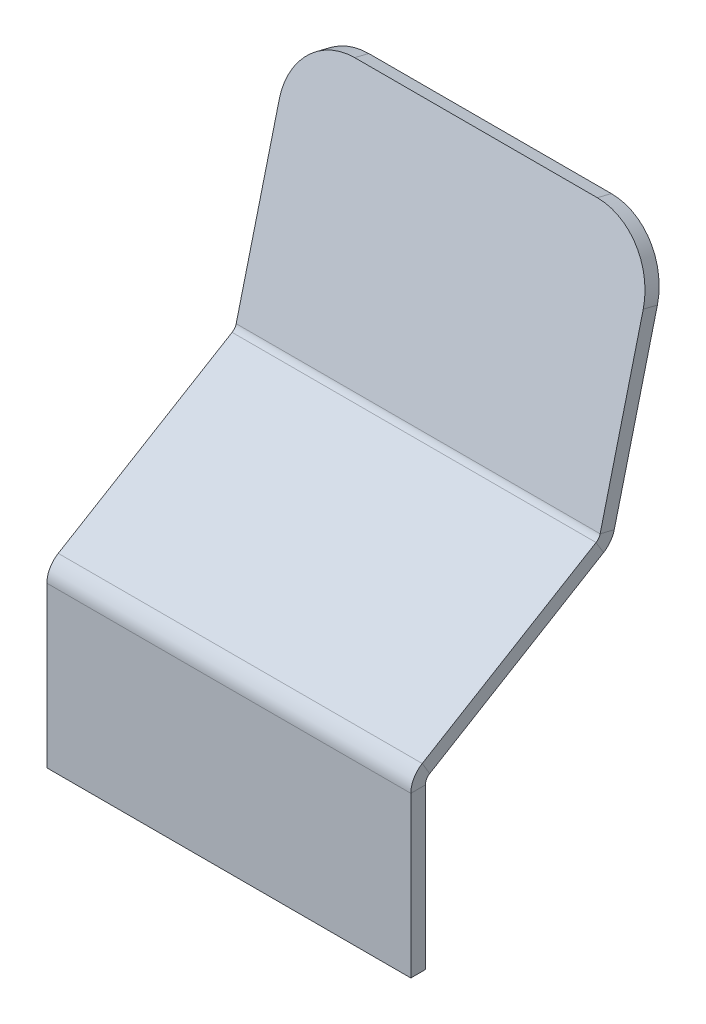
ISO-10303-21;
HEADER;
FILE_DESCRIPTION(('STEP AP214'),'2;1');
FILE_NAME('part.step','',(''),(''),'','','');
FILE_SCHEMA(('AUTOMOTIVE_DESIGN { 1 0 10303 214 1 1 1 1 }'));
ENDSEC;
DATA;
#1=APPLICATION_CONTEXT('core data for automotive mechanical design processes');
#2=APPLICATION_PROTOCOL_DEFINITION('international standard','automotive_design',2000,#1);
#3=PRODUCT_CONTEXT('',#1,'mechanical');
#4=PRODUCT('Part','Part','',(#3));
#5=PRODUCT_RELATED_PRODUCT_CATEGORY('part','',(#4));
#6=PRODUCT_DEFINITION_FORMATION('','',#4);
#7=PRODUCT_DEFINITION_CONTEXT('part definition',#1,'design');
#8=PRODUCT_DEFINITION('design','',#6,#7);
#9=PRODUCT_DEFINITION_SHAPE('','',#8);
#10=(LENGTH_UNIT() NAMED_UNIT(*) SI_UNIT(.MILLI.,.METRE.));
#11=(NAMED_UNIT(*) PLANE_ANGLE_UNIT() SI_UNIT($,.RADIAN.));
#12=(NAMED_UNIT(*) SI_UNIT($,.STERADIAN.) SOLID_ANGLE_UNIT());
#13=UNCERTAINTY_MEASURE_WITH_UNIT(LENGTH_MEASURE(1.E-05),#10,'distance_accuracy_value','');
#14=(GEOMETRIC_REPRESENTATION_CONTEXT(3) GLOBAL_UNCERTAINTY_ASSIGNED_CONTEXT((#13)) GLOBAL_UNIT_ASSIGNED_CONTEXT((#10,
#11,#12)) REPRESENTATION_CONTEXT('',''));
#15=CARTESIAN_POINT('',(0.,0.,0.));
#16=DIRECTION('',(0.,0.,1.));
#17=DIRECTION('',(1.,0.,0.));
#18=AXIS2_PLACEMENT_3D('',#15,#16,#17);
#19=CARTESIAN_POINT('',(15.,16.984718308508,-15.7852220767239));
#20=DIRECTION('',(-1.,0.,0.));
#21=DIRECTION('',(0.,-1.,0.));
#22=AXIS2_PLACEMENT_3D('',#19,#20,#21);
#23=PLANE('',#22);
#24=DIRECTION('',(0.,-0.85716730070211,-0.515038074910058));
#25=VECTOR('',#24,1.);
#26=CARTESIAN_POINT('',(15.,15.9535265939989,-14.0690308638967));
#27=LINE('',#26,#25);
#28=CARTESIAN_POINT('',(15.,15.9535265939989,-14.0690308638967));
#29=VERTEX_POINT('',#28);
#30=CARTESIAN_POINT('',(15.,14.9249258331564,-14.6870765537888));
#31=VERTEX_POINT('',#30);
#32=EDGE_CURVE('E220',#29,#31,#27,.T.);
#33=ORIENTED_EDGE('',*,*,#32,.F.);
#34=DIRECTION('',(0.,0.515038074910059,-0.85716730070211));
#35=VECTOR('',#34,1.);
#36=CARTESIAN_POINT('',(15.,7.12864068418413,0.618045689892071));
#37=LINE('',#36,#35);
#38=CARTESIAN_POINT('',(15.,7.3432818894682,0.260822735870822));
#39=VERTEX_POINT('',#38);
#40=EDGE_CURVE('E228',#39,#29,#37,.T.);
#41=ORIENTED_EDGE('',*,*,#40,.F.);
#42=DIRECTION('',(0.,-0.85716730070211,-0.515038074910059));
#43=VECTOR('',#42,1.);
#44=CARTESIAN_POINT('',(15.,6.31468112862567,-0.357222954021248));
#45=LINE('',#44,#43);
#46=CARTESIAN_POINT('',(15.,6.31468112862566,-0.357222954021249));
#47=VERTEX_POINT('',#46);
#48=EDGE_CURVE('E239',#47,#39,#45,.F.);
#49=ORIENTED_EDGE('',*,*,#48,.F.);
#50=DIRECTION('',(0.,-0.515038074910059,0.85716730070211));
#51=VECTOR('',#50,1.);
#52=CARTESIAN_POINT('',(15.,15.9561175476654,-16.403267766616));
#53=LINE('',#52,#51);
#54=EDGE_CURVE('E233',#47,#31,#53,.F.);
#55=ORIENTED_EDGE('',*,*,#54,.T.);
#56=EDGE_LOOP('',(#33,#41,#49,#55));
#57=FACE_BOUND('',#56,.T.);
#58=ADVANCED_FACE('F68',(#57),#23,.F.);
#59=CARTESIAN_POINT('',(-15.,7.12864068418413,0.618045689892071));
#60=DIRECTION('',(1.,0.,0.));
#61=DIRECTION('',(0.,1.,0.));
#62=AXIS2_PLACEMENT_3D('',#59,#60,#61);
#63=PLANE('',#62);
#64=DIRECTION('',(0.,-0.85716730070211,-0.515038074910058));
#65=VECTOR('',#64,1.);
#66=CARTESIAN_POINT('',(-15.,15.9535265939989,-14.0690308638967));
#67=LINE('',#66,#65);
#68=CARTESIAN_POINT('',(-15.,15.9535265939989,-14.0690308638967));
#69=VERTEX_POINT('',#68);
#70=CARTESIAN_POINT('',(-15.,14.9249258331564,-14.6870765537888));
#71=VERTEX_POINT('',#70);
#72=EDGE_CURVE('E218',#69,#71,#67,.T.);
#73=ORIENTED_EDGE('',*,*,#72,.T.);
#74=DIRECTION('',(0.,0.515038074910059,-0.85716730070211));
#75=VECTOR('',#74,1.);
#76=CARTESIAN_POINT('',(-15.,6.1000399233416,0.));
#77=LINE('',#76,#75);
#78=CARTESIAN_POINT('',(-15.,6.31468112862566,-0.357222954021251));
#79=VERTEX_POINT('',#78);
#80=EDGE_CURVE('E231',#71,#79,#77,.F.);
#81=ORIENTED_EDGE('',*,*,#80,.T.);
#82=DIRECTION('',(0.,-0.85716730070211,-0.515038074910059));
#83=VECTOR('',#82,1.);
#84=CARTESIAN_POINT('',(-15.,7.34328188946819,0.26082273587082));
#85=LINE('',#84,#83);
#86=CARTESIAN_POINT('',(-15.,7.3432818894682,0.26082273587082));
#87=VERTEX_POINT('',#86);
#88=EDGE_CURVE('E223',#79,#87,#85,.F.);
#89=ORIENTED_EDGE('',*,*,#88,.T.);
#90=DIRECTION('',(0.,-0.515038074910059,0.85716730070211));
#91=VECTOR('',#90,1.);
#92=CARTESIAN_POINT('',(-15.,7.12864068418413,0.618045689892071));
#93=LINE('',#92,#91);
#94=EDGE_CURVE('E225',#69,#87,#93,.T.);
#95=ORIENTED_EDGE('',*,*,#94,.F.);
#96=EDGE_LOOP('',(#73,#81,#89,#95));
#97=FACE_BOUND('',#96,.T.);
#98=ADVANCED_FACE('F343',(#97),#63,.F.);
#99=CARTESIAN_POINT('',(15.,7.12864068418413,0.618045689892071));
#100=DIRECTION('',(0.,-0.85716730070211,-0.515038074910059));
#101=DIRECTION('',(0.,0.515038074910059,-0.85716730070211));
#102=AXIS2_PLACEMENT_3D('',#99,#100,#101);
#103=PLANE('',#102);
#104=DIRECTION('',(-1.,0.,0.));
#105=VECTOR('',#104,1.);
#106=CARTESIAN_POINT('',(-15.,15.9535265939989,-14.0690308638967));
#107=LINE('',#106,#105);
#108=EDGE_CURVE('E213',#69,#29,#107,.F.);
#109=ORIENTED_EDGE('',*,*,#108,.F.);
#110=ORIENTED_EDGE('',*,*,#94,.T.);
#111=DIRECTION('',(1.,0.,0.));
#112=VECTOR('',#111,1.);
#113=CARTESIAN_POINT('',(-15.,7.3432818894682,0.26082273587082));
#114=LINE('',#113,#112);
#115=EDGE_CURVE('E236',#39,#87,#114,.F.);
#116=ORIENTED_EDGE('',*,*,#115,.F.);
#117=ORIENTED_EDGE('',*,*,#40,.T.);
#118=EDGE_LOOP('',(#109,#110,#116,#117));
#119=FACE_BOUND('',#118,.T.);
#120=ADVANCED_FACE('F333',(#119),#103,.F.);
#121=CARTESIAN_POINT('',(15.,6.1000399233416,0.));
#122=DIRECTION('',(0.,-0.85716730070211,-0.515038074910059));
#123=DIRECTION('',(0.,0.515038074910059,-0.85716730070211));
#124=AXIS2_PLACEMENT_3D('',#121,#122,#123);
#125=PLANE('',#124);
#126=ORIENTED_EDGE('',*,*,#80,.F.);
#127=DIRECTION('',(-1.,0.,0.));
#128=VECTOR('',#127,1.);
#129=CARTESIAN_POINT('',(-15.,14.9249258331564,-14.6870765537888));
#130=LINE('',#129,#128);
#131=EDGE_CURVE('E187',#71,#31,#130,.F.);
#132=ORIENTED_EDGE('',*,*,#131,.T.);
#133=ORIENTED_EDGE('',*,*,#54,.F.);
#134=DIRECTION('',(1.,0.,0.));
#135=VECTOR('',#134,1.);
#136=CARTESIAN_POINT('',(-15.,6.31468112862566,-0.35722295402125));
#137=LINE('',#136,#135);
#138=EDGE_CURVE('E242',#79,#47,#137,.T.);
#139=ORIENTED_EDGE('',*,*,#138,.F.);
#140=EDGE_LOOP('',(#126,#132,#133,#139));
#141=FACE_BOUND('',#140,.T.);
#142=ADVANCED_FACE('F347',(#141),#125,.T.);
#143=CARTESIAN_POINT('',(-15.,7.5,1.2));
#144=DIRECTION('',(1.,0.,0.));
#145=DIRECTION('',(0.,1.,0.));
#146=AXIS2_PLACEMENT_3D('',#143,#144,#145);
#147=PLANE('',#146);
#148=DIRECTION('',(0.,0.,1.));
#149=VECTOR('',#148,1.);
#150=CARTESIAN_POINT('',(-15.,5.68329169492849,0.));
#151=LINE('',#150,#149);
#152=CARTESIAN_POINT('',(-15.,5.68329169492849,0.));
#153=VERTEX_POINT('',#152);
#154=CARTESIAN_POINT('',(-15.,5.68329169492849,1.2));
#155=VERTEX_POINT('',#154);
#156=EDGE_CURVE('E263',#153,#155,#151,.T.);
#157=ORIENTED_EDGE('',*,*,#156,.F.);
#158=DIRECTION('',(0.,-1.,0.));
#159=VECTOR('',#158,1.);
#160=CARTESIAN_POINT('',(-15.,7.5,0.));
#161=LINE('',#160,#159);
#162=CARTESIAN_POINT('',(-15.,-7.5,0.));
#163=VERTEX_POINT('',#162);
#164=EDGE_CURVE('E266',#153,#163,#161,.T.);
#165=ORIENTED_EDGE('',*,*,#164,.T.);
#166=DIRECTION('',(0.,0.,-1.));
#167=VECTOR('',#166,1.);
#168=CARTESIAN_POINT('',(-15.,-7.5,1.2));
#169=LINE('',#168,#167);
#170=CARTESIAN_POINT('',(-15.,-7.5,1.2));
#171=VERTEX_POINT('',#170);
#172=EDGE_CURVE('E285',#171,#163,#169,.T.);
#173=ORIENTED_EDGE('',*,*,#172,.F.);
#174=DIRECTION('',(0.,-1.,0.));
#175=VECTOR('',#174,1.);
#176=CARTESIAN_POINT('',(-15.,7.5,1.2));
#177=LINE('',#176,#175);
#178=EDGE_CURVE('E275',#155,#171,#177,.T.);
#179=ORIENTED_EDGE('',*,*,#178,.F.);
#180=EDGE_LOOP('',(#157,#165,#173,#179));
#181=FACE_BOUND('',#180,.T.);
#182=ADVANCED_FACE('F70',(#181),#147,.F.);
#183=CARTESIAN_POINT('',(15.,7.5,1.2));
#184=DIRECTION('',(-1.,0.,0.));
#185=DIRECTION('',(0.,-1.,0.));
#186=AXIS2_PLACEMENT_3D('',#183,#184,#185);
#187=PLANE('',#186);
#188=DIRECTION('',(0.,0.,1.));
#189=VECTOR('',#188,1.);
#190=CARTESIAN_POINT('',(15.,5.68329169492849,0.));
#191=LINE('',#190,#189);
#192=CARTESIAN_POINT('',(15.,5.68329169492849,0.));
#193=VERTEX_POINT('',#192);
#194=CARTESIAN_POINT('',(15.,5.6832916949285,1.2));
#195=VERTEX_POINT('',#194);
#196=EDGE_CURVE('E260',#193,#195,#191,.T.);
#197=ORIENTED_EDGE('',*,*,#196,.T.);
#198=DIRECTION('',(0.,1.,0.));
#199=VECTOR('',#198,1.);
#200=CARTESIAN_POINT('',(15.,7.5,1.2));
#201=LINE('',#200,#199);
#202=CARTESIAN_POINT('',(15.,-7.5,1.2));
#203=VERTEX_POINT('',#202);
#204=EDGE_CURVE('E279',#203,#195,#201,.T.);
#205=ORIENTED_EDGE('',*,*,#204,.F.);
#206=DIRECTION('',(0.,0.,-1.));
#207=VECTOR('',#206,1.);
#208=CARTESIAN_POINT('',(15.,-7.5,1.2));
#209=LINE('',#208,#207);
#210=CARTESIAN_POINT('',(15.,-7.5,0.));
#211=VERTEX_POINT('',#210);
#212=EDGE_CURVE('E282',#203,#211,#209,.T.);
#213=ORIENTED_EDGE('',*,*,#212,.T.);
#214=DIRECTION('',(0.,1.,0.));
#215=VECTOR('',#214,1.);
#216=CARTESIAN_POINT('',(15.,7.5,0.));
#217=LINE('',#216,#215);
#218=EDGE_CURVE('E272',#211,#193,#217,.T.);
#219=ORIENTED_EDGE('',*,*,#218,.T.);
#220=EDGE_LOOP('',(#197,#205,#213,#219));
#221=FACE_BOUND('',#220,.T.);
#222=ADVANCED_FACE('F356',(#221),#187,.F.);
#223=CARTESIAN_POINT('',(-15.,-7.5,1.2));
#224=DIRECTION('',(0.,0.,1.));
#225=DIRECTION('',(1.,0.,0.));
#226=AXIS2_PLACEMENT_3D('',#223,#224,#225);
#227=PLANE('',#226);
#228=ORIENTED_EDGE('',*,*,#204,.T.);
#229=DIRECTION('',(1.,0.,0.));
#230=VECTOR('',#229,1.);
#231=CARTESIAN_POINT('',(15.,5.6832916949285,1.2));
#232=LINE('',#231,#230);
#233=EDGE_CURVE('E254',#195,#155,#232,.F.);
#234=ORIENTED_EDGE('',*,*,#233,.T.);
#235=ORIENTED_EDGE('',*,*,#178,.T.);
#236=DIRECTION('',(1.,0.,0.));
#237=VECTOR('',#236,1.);
#238=CARTESIAN_POINT('',(-15.,-7.5,1.2));
#239=LINE('',#238,#237);
#240=EDGE_CURVE('E277',#171,#203,#239,.T.);
#241=ORIENTED_EDGE('',*,*,#240,.T.);
#242=EDGE_LOOP('',(#228,#234,#235,#241));
#243=FACE_BOUND('',#242,.T.);
#244=ADVANCED_FACE('F359',(#243),#227,.T.);
#245=CARTESIAN_POINT('',(-15.,-7.5,0.));
#246=DIRECTION('',(0.,0.,1.));
#247=DIRECTION('',(1.,0.,0.));
#248=AXIS2_PLACEMENT_3D('',#245,#246,#247);
#249=PLANE('',#248);
#250=DIRECTION('',(1.,0.,0.));
#251=VECTOR('',#250,1.);
#252=CARTESIAN_POINT('',(15.,5.68329169492849,0.));
#253=LINE('',#252,#251);
#254=EDGE_CURVE('E250',#193,#153,#253,.F.);
#255=ORIENTED_EDGE('',*,*,#254,.F.);
#256=ORIENTED_EDGE('',*,*,#218,.F.);
#257=DIRECTION('',(1.,0.,0.));
#258=VECTOR('',#257,1.);
#259=CARTESIAN_POINT('',(-15.,-7.5,0.));
#260=LINE('',#259,#258);
#261=EDGE_CURVE('E270',#163,#211,#260,.T.);
#262=ORIENTED_EDGE('',*,*,#261,.F.);
#263=ORIENTED_EDGE('',*,*,#164,.F.);
#264=EDGE_LOOP('',(#255,#256,#262,#263));
#265=FACE_BOUND('',#264,.T.);
#266=ADVANCED_FACE('F368',(#265),#249,.F.);
#267=CARTESIAN_POINT('',(-15.,-7.5,1.2));
#268=DIRECTION('',(0.,1.,0.));
#269=DIRECTION('',(-1.,0.,0.));
#270=AXIS2_PLACEMENT_3D('',#267,#268,#269);
#271=PLANE('',#270);
#272=ORIENTED_EDGE('',*,*,#261,.T.);
#273=ORIENTED_EDGE('',*,*,#212,.F.);
#274=ORIENTED_EDGE('',*,*,#240,.F.);
#275=ORIENTED_EDGE('',*,*,#172,.T.);
#276=EDGE_LOOP('',(#272,#273,#274,#275));
#277=FACE_BOUND('',#276,.T.);
#278=ADVANCED_FACE('F365',(#277),#271,.F.);
#279=CARTESIAN_POINT('',(-15.,5.68329169492849,-0.736599999999999));
#280=DIRECTION('',(-1.,0.,0.));
#281=DIRECTION('',(0.,0.,1.));
#282=AXIS2_PLACEMENT_3D('',#279,#280,#281);
#283=PLANE('',#282);
#284=ORIENTED_EDGE('',*,*,#88,.F.);
#285=CARTESIAN_POINT('',(-15.,5.68329169492849,-0.736599999999999));
#286=DIRECTION('',(1.,0.,0.));
#287=DIRECTION('',(0.,0.,-1.));
#288=AXIS2_PLACEMENT_3D('',#285,#286,#287);
#289=CIRCLE('',#288,0.736599999999999);
#290=EDGE_CURVE('E246',#153,#79,#289,.F.);
#291=ORIENTED_EDGE('',*,*,#290,.F.);
#292=ORIENTED_EDGE('',*,*,#156,.T.);
#293=CARTESIAN_POINT('',(-15.,5.68329169492849,-0.736599999999999));
#294=DIRECTION('',(1.,0.,0.));
#295=DIRECTION('',(0.,0.,-1.));
#296=AXIS2_PLACEMENT_3D('',#293,#294,#295);
#297=CIRCLE('',#296,1.9366);
#298=EDGE_CURVE('E257',#155,#87,#297,.F.);
#299=ORIENTED_EDGE('',*,*,#298,.T.);
#300=EDGE_LOOP('',(#284,#291,#292,#299));
#301=FACE_BOUND('',#300,.T.);
#302=ADVANCED_FACE('F339',(#301),#283,.T.);
#303=CARTESIAN_POINT('',(15.,5.68329169492849,-0.736599999999997));
#304=DIRECTION('',(-1.,0.,0.));
#305=DIRECTION('',(0.,0.,1.));
#306=AXIS2_PLACEMENT_3D('',#303,#304,#305);
#307=PLANE('',#306);
#308=CARTESIAN_POINT('',(15.,5.68329169492849,-0.736599999999997));
#309=DIRECTION('',(1.,0.,0.));
#310=DIRECTION('',(0.,0.,-1.));
#311=AXIS2_PLACEMENT_3D('',#308,#309,#310);
#312=CIRCLE('',#311,0.736599999999999);
#313=EDGE_CURVE('E227',#47,#193,#312,.T.);
#314=ORIENTED_EDGE('',*,*,#313,.F.);
#315=ORIENTED_EDGE('',*,*,#48,.T.);
#316=CARTESIAN_POINT('',(15.,5.68329169492849,-0.736599999999997));
#317=DIRECTION('',(1.,0.,0.));
#318=DIRECTION('',(0.,0.,-1.));
#319=AXIS2_PLACEMENT_3D('',#316,#317,#318);
#320=CIRCLE('',#319,1.9366);
#321=EDGE_CURVE('E249',#39,#195,#320,.T.);
#322=ORIENTED_EDGE('',*,*,#321,.T.);
#323=ORIENTED_EDGE('',*,*,#196,.F.);
#324=EDGE_LOOP('',(#314,#315,#322,#323));
#325=FACE_BOUND('',#324,.T.);
#326=ADVANCED_FACE('F353',(#325),#307,.F.);
#327=CARTESIAN_POINT('',(15.,5.68329169492849,-0.736599999999997));
#328=DIRECTION('',(1.,0.,0.));
#329=DIRECTION('',(0.,0.85716730070211,0.515038074910059));
#330=AXIS2_PLACEMENT_3D('',#327,#328,#329);
#331=CYLINDRICAL_SURFACE('',#330,1.9366);
#332=ORIENTED_EDGE('',*,*,#233,.F.);
#333=ORIENTED_EDGE('',*,*,#321,.F.);
#334=ORIENTED_EDGE('',*,*,#115,.T.);
#335=ORIENTED_EDGE('',*,*,#298,.F.);
#336=EDGE_LOOP('',(#332,#333,#334,#335));
#337=FACE_BOUND('',#336,.T.);
#338=ADVANCED_FACE('F336',(#337),#331,.T.);
#339=CARTESIAN_POINT('',(15.,5.68329169492849,-0.736599999999997));
#340=DIRECTION('',(1.,0.,0.));
#341=DIRECTION('',(0.,0.85716730070211,0.515038074910059));
#342=AXIS2_PLACEMENT_3D('',#339,#340,#341);
#343=CYLINDRICAL_SURFACE('',#342,0.736599999999999);
#344=ORIENTED_EDGE('',*,*,#254,.T.);
#345=ORIENTED_EDGE('',*,*,#290,.T.);
#346=ORIENTED_EDGE('',*,*,#138,.T.);
#347=ORIENTED_EDGE('',*,*,#313,.T.);
#348=EDGE_LOOP('',(#344,#345,#346,#347));
#349=FACE_BOUND('',#348,.T.);
#350=ADVANCED_FACE('F350',(#349),#343,.F.);
#351=CARTESIAN_POINT('',(15.,16.5849160276961,-13.6896538179179));
#352=DIRECTION('',(1.,0.,0.));
#353=DIRECTION('',(0.,0.,-1.));
#354=AXIS2_PLACEMENT_3D('',#351,#352,#353);
#355=PLANE('',#354);
#356=DIRECTION('',(0.,-0.241921895599667,-0.970295726275997));
#357=VECTOR('',#356,1.);
#358=CARTESIAN_POINT('',(15.,16.1164100846778,-15.568728521424));
#359=LINE('',#358,#357);
#360=CARTESIAN_POINT('',(15.,16.4067163593974,-14.4043736498928));
#361=VERTEX_POINT('',#360);
#362=CARTESIAN_POINT('',(15.,16.1164100846778,-15.568728521424));
#363=VERTEX_POINT('',#362);
#364=EDGE_CURVE('E208',#361,#363,#359,.T.);
#365=ORIENTED_EDGE('',*,*,#364,.F.);
#366=CARTESIAN_POINT('',(15.,16.5849160276961,-13.6896538179179));
#367=DIRECTION('',(-1.,0.,0.));
#368=DIRECTION('',(0.,0.,1.));
#369=AXIS2_PLACEMENT_3D('',#366,#367,#368);
#370=CIRCLE('',#369,0.736599999999993);
#371=EDGE_CURVE('E190',#29,#361,#370,.F.);
#372=ORIENTED_EDGE('',*,*,#371,.F.);
#373=ORIENTED_EDGE('',*,*,#32,.T.);
#374=CARTESIAN_POINT('',(15.,16.5849160276961,-13.6896538179179));
#375=DIRECTION('',(-1.,0.,0.));
#376=DIRECTION('',(0.,0.,1.));
#377=AXIS2_PLACEMENT_3D('',#374,#375,#376);
#378=CIRCLE('',#377,1.93659999999999);
#379=EDGE_CURVE('E217',#31,#363,#378,.F.);
#380=ORIENTED_EDGE('',*,*,#379,.T.);
#381=EDGE_LOOP('',(#365,#372,#373,#380));
#382=FACE_BOUND('',#381,.T.);
#383=ADVANCED_FACE('F326',(#382),#355,.T.);
#384=CARTESIAN_POINT('',(-15.,16.5849160276961,-13.6896538179179));
#385=DIRECTION('',(1.,0.,0.));
#386=DIRECTION('',(0.,0.,-1.));
#387=AXIS2_PLACEMENT_3D('',#384,#385,#386);
#388=PLANE('',#387);
#389=CARTESIAN_POINT('',(-15.,16.5849160276961,-13.6896538179179));
#390=DIRECTION('',(-1.,0.,0.));
#391=DIRECTION('',(0.,0.,1.));
#392=AXIS2_PLACEMENT_3D('',#389,#390,#391);
#393=CIRCLE('',#392,0.736599999999993);
#394=CARTESIAN_POINT('',(-15.,16.4067163593974,-14.4043736498928));
#395=VERTEX_POINT('',#394);
#396=EDGE_CURVE('E177',#395,#69,#393,.T.);
#397=ORIENTED_EDGE('',*,*,#396,.F.);
#398=DIRECTION('',(0.,-0.241921895599667,-0.970295726275997));
#399=VECTOR('',#398,1.);
#400=CARTESIAN_POINT('',(-15.,16.4067163593974,-14.4043736498928));
#401=LINE('',#400,#399);
#402=CARTESIAN_POINT('',(-15.,16.1164100846778,-15.568728521424));
#403=VERTEX_POINT('',#402);
#404=EDGE_CURVE('E174',#395,#403,#401,.T.);
#405=ORIENTED_EDGE('',*,*,#404,.T.);
#406=CARTESIAN_POINT('',(-15.,16.5849160276961,-13.6896538179179));
#407=DIRECTION('',(-1.,0.,0.));
#408=DIRECTION('',(0.,0.,1.));
#409=AXIS2_PLACEMENT_3D('',#406,#407,#408);
#410=CIRCLE('',#409,1.93659999999999);
#411=EDGE_CURVE('E182',#403,#71,#410,.T.);
#412=ORIENTED_EDGE('',*,*,#411,.T.);
#413=ORIENTED_EDGE('',*,*,#72,.F.);
#414=EDGE_LOOP('',(#397,#405,#412,#413));
#415=FACE_BOUND('',#414,.T.);
#416=ADVANCED_FACE('F193',(#415),#388,.F.);
#417=CARTESIAN_POINT('',(-15.,16.5849160276961,-13.6896538179179));
#418=DIRECTION('',(-1.,0.,0.));
#419=DIRECTION('',(0.,-0.241921895599667,-0.970295726275997));
#420=AXIS2_PLACEMENT_3D('',#417,#418,#419);
#421=CYLINDRICAL_SURFACE('',#420,1.93659999999999);
#422=ORIENTED_EDGE('',*,*,#131,.F.);
#423=ORIENTED_EDGE('',*,*,#411,.F.);
#424=DIRECTION('',(-1.,0.,0.));
#425=VECTOR('',#424,1.);
#426=CARTESIAN_POINT('',(-15.,16.1164100846778,-15.568728521424));
#427=LINE('',#426,#425);
#428=EDGE_CURVE('E184',#363,#403,#427,.T.);
#429=ORIENTED_EDGE('',*,*,#428,.F.);
#430=ORIENTED_EDGE('',*,*,#379,.F.);
#431=EDGE_LOOP('',(#422,#423,#429,#430));
#432=FACE_BOUND('',#431,.T.);
#433=ADVANCED_FACE('F183',(#432),#421,.T.);
#434=CARTESIAN_POINT('',(-15.,16.5849160276961,-13.6896538179179));
#435=DIRECTION('',(-1.,0.,0.));
#436=DIRECTION('',(0.,-0.241921895599667,-0.970295726275997));
#437=AXIS2_PLACEMENT_3D('',#434,#435,#436);
#438=CYLINDRICAL_SURFACE('',#437,0.736599999999993);
#439=ORIENTED_EDGE('',*,*,#108,.T.);
#440=ORIENTED_EDGE('',*,*,#371,.T.);
#441=DIRECTION('',(1.,0.,0.));
#442=VECTOR('',#441,1.);
#443=CARTESIAN_POINT('',(15.,16.4067163593974,-14.4043736498928));
#444=LINE('',#443,#442);
#445=EDGE_CURVE('E195',#361,#395,#444,.F.);
#446=ORIENTED_EDGE('',*,*,#445,.T.);
#447=ORIENTED_EDGE('',*,*,#396,.T.);
#448=EDGE_LOOP('',(#439,#440,#446,#447));
#449=FACE_BOUND('',#448,.T.);
#450=ADVANCED_FACE('F321',(#449),#438,.F.);
#451=CARTESIAN_POINT('',(-15.,15.8203634369768,-15.4949158020043));
#452=DIRECTION('',(-1.,0.,0.));
#453=DIRECTION('',(0.,0.,1.));
#454=AXIS2_PLACEMENT_3D('',#451,#452,#453);
#455=PLANE('',#454);
#456=DIRECTION('',(0.,0.970295726275997,-0.241921895599667));
#457=VECTOR('',#456,1.);
#458=CARTESIAN_POINT('',(-15.,16.1106697116964,-14.3305609304731));
#459=LINE('',#458,#457);
#460=CARTESIAN_POINT('',(-15.,30.6651056058363,-17.9593893644681));
#461=VERTEX_POINT('',#460);
#462=EDGE_CURVE('E311',#461,#395,#459,.F.);
#463=ORIENTED_EDGE('',*,*,#462,.F.);
#464=DIRECTION('',(0.,0.241921895599667,0.970295726275997));
#465=VECTOR('',#464,1.);
#466=CARTESIAN_POINT('',(-15.,30.3747993311167,-19.1237442359993));
#467=LINE('',#466,#465);
#468=CARTESIAN_POINT('',(-15.,30.3747993311167,-19.1237442359993));
#469=VERTEX_POINT('',#468);
#470=EDGE_CURVE('E91',#461,#469,#467,.F.);
#471=ORIENTED_EDGE('',*,*,#470,.T.);
#472=DIRECTION('',(0.,-0.970295726275997,0.241921895599667));
#473=VECTOR('',#472,1.);
#474=CARTESIAN_POINT('',(-15.,15.8203634369768,-15.4949158020043));
#475=LINE('',#474,#473);
#476=EDGE_CURVE('E170',#469,#403,#475,.T.);
#477=ORIENTED_EDGE('',*,*,#476,.T.);
#478=ORIENTED_EDGE('',*,*,#404,.F.);
#479=EDGE_LOOP('',(#463,#471,#477,#478));
#480=FACE_BOUND('',#479,.T.);
#481=ADVANCED_FACE('F172',(#480),#455,.T.);
#482=CARTESIAN_POINT('',(15.,35.2262779624967,-20.3333537139977));
#483=DIRECTION('',(1.,0.,0.));
#484=DIRECTION('',(0.,1.,0.));
#485=AXIS2_PLACEMENT_3D('',#482,#483,#484);
#486=PLANE('',#485);
#487=DIRECTION('',(0.,0.970295726275997,-0.241921895599667));
#488=VECTOR('',#487,1.);
#489=CARTESIAN_POINT('',(15.,35.2262779624967,-20.3333537139977));
#490=LINE('',#489,#488);
#491=CARTESIAN_POINT('',(15.,30.3747993311167,-19.1237442359993));
#492=VERTEX_POINT('',#491);
#493=EDGE_CURVE('E198',#363,#492,#490,.T.);
#494=ORIENTED_EDGE('',*,*,#493,.T.);
#495=DIRECTION('',(0.,0.241921895599667,0.970295726275997));
#496=VECTOR('',#495,1.);
#497=CARTESIAN_POINT('',(15.,30.3747993311167,-19.1237442359993));
#498=LINE('',#497,#496);
#499=CARTESIAN_POINT('',(15.,30.6651056058363,-17.9593893644681));
#500=VERTEX_POINT('',#499);
#501=EDGE_CURVE('E13',#492,#500,#498,.T.);
#502=ORIENTED_EDGE('',*,*,#501,.T.);
#503=DIRECTION('',(0.,-0.970295726275997,0.241921895599667));
#504=VECTOR('',#503,1.);
#505=CARTESIAN_POINT('',(15.,16.1106697116964,-14.3305609304731));
#506=LINE('',#505,#504);
#507=EDGE_CURVE('E199',#361,#500,#506,.F.);
#508=ORIENTED_EDGE('',*,*,#507,.F.);
#509=ORIENTED_EDGE('',*,*,#364,.T.);
#510=EDGE_LOOP('',(#494,#502,#508,#509));
#511=FACE_BOUND('',#510,.T.);
#512=ADVANCED_FACE('F316',(#511),#486,.T.);
#513=CARTESIAN_POINT('',(-15.,15.8203634369768,-15.4949158020043));
#514=DIRECTION('',(0.,-0.241921895599667,-0.970295726275997));
#515=DIRECTION('',(0.,0.970295726275997,-0.241921895599667));
#516=AXIS2_PLACEMENT_3D('',#513,#514,#515);
#517=PLANE('',#516);
#518=ORIENTED_EDGE('',*,*,#476,.F.);
#519=CARTESIAN_POINT('',(-9.99999999999999,30.3747993311167,-19.1237442359993));
#520=DIRECTION('',(0.,-0.241921895599667,-0.970295726275997));
#521=DIRECTION('',(0.,0.970295726275997,-0.241921895599667));
#522=AXIS2_PLACEMENT_3D('',#519,#520,#521);
#523=CIRCLE('',#522,5.);
#524=CARTESIAN_POINT('',(-9.99999999999999,35.2262779624967,-20.3333537139977));
#525=VERTEX_POINT('',#524);
#526=EDGE_CURVE('E76',#469,#525,#523,.T.);
#527=ORIENTED_EDGE('',*,*,#526,.T.);
#528=DIRECTION('',(-1.,0.,0.));
#529=VECTOR('',#528,1.);
#530=CARTESIAN_POINT('',(-15.,35.2262779624967,-20.3333537139977));
#531=LINE('',#530,#529);
#532=CARTESIAN_POINT('',(10.,35.2262779624967,-20.3333537139977));
#533=VERTEX_POINT('',#532);
#534=EDGE_CURVE('E178',#533,#525,#531,.T.);
#535=ORIENTED_EDGE('',*,*,#534,.F.);
#536=CARTESIAN_POINT('',(10.,30.3747993311167,-19.1237442359993));
#537=DIRECTION('',(0.,-0.241921895599667,-0.970295726275997));
#538=DIRECTION('',(0.,0.970295726275997,-0.241921895599667));
#539=AXIS2_PLACEMENT_3D('',#536,#537,#538);
#540=CIRCLE('',#539,5.);
#541=EDGE_CURVE('E83',#533,#492,#540,.T.);
#542=ORIENTED_EDGE('',*,*,#541,.T.);
#543=ORIENTED_EDGE('',*,*,#493,.F.);
#544=ORIENTED_EDGE('',*,*,#428,.T.);
#545=EDGE_LOOP('',(#518,#527,#535,#542,#543,#544));
#546=FACE_BOUND('',#545,.T.);
#547=ADVANCED_FACE('F197',(#546),#517,.T.);
#548=CARTESIAN_POINT('',(-15.,16.1106697116964,-14.3305609304731));
#549=DIRECTION('',(0.,-0.241921895599667,-0.970295726275997));
#550=DIRECTION('',(0.,0.970295726275997,-0.241921895599667));
#551=AXIS2_PLACEMENT_3D('',#548,#549,#550);
#552=PLANE('',#551);
#553=DIRECTION('',(1.,0.,0.));
#554=VECTOR('',#553,1.);
#555=CARTESIAN_POINT('',(-15.,35.5165842372163,-19.1689988424665));
#556=LINE('',#555,#554);
#557=CARTESIAN_POINT('',(10.,35.5165842372163,-19.1689988424665));
#558=VERTEX_POINT('',#557);
#559=CARTESIAN_POINT('',(-9.99999999999999,35.5165842372163,-19.1689988424665));
#560=VERTEX_POINT('',#559);
#561=EDGE_CURVE('E202',#558,#560,#556,.F.);
#562=ORIENTED_EDGE('',*,*,#561,.T.);
#563=CARTESIAN_POINT('',(-9.99999999999999,30.6651056058363,-17.9593893644681));
#564=DIRECTION('',(0.,-0.241921895599667,-0.970295726275997));
#565=DIRECTION('',(0.,0.970295726275997,-0.241921895599667));
#566=AXIS2_PLACEMENT_3D('',#563,#564,#565);
#567=CIRCLE('',#566,5.);
#568=EDGE_CURVE('E295',#560,#461,#567,.F.);
#569=ORIENTED_EDGE('',*,*,#568,.T.);
#570=ORIENTED_EDGE('',*,*,#462,.T.);
#571=ORIENTED_EDGE('',*,*,#445,.F.);
#572=ORIENTED_EDGE('',*,*,#507,.T.);
#573=CARTESIAN_POINT('',(10.,30.6651056058363,-17.9593893644681));
#574=DIRECTION('',(0.,-0.241921895599667,-0.970295726275997));
#575=DIRECTION('',(0.,0.970295726275997,-0.241921895599667));
#576=AXIS2_PLACEMENT_3D('',#573,#574,#575);
#577=CIRCLE('',#576,5.);
#578=EDGE_CURVE('E293',#500,#558,#577,.F.);
#579=ORIENTED_EDGE('',*,*,#578,.T.);
#580=EDGE_LOOP('',(#562,#569,#570,#571,#572,#579));
#581=FACE_BOUND('',#580,.T.);
#582=ADVANCED_FACE('F309',(#581),#552,.F.);
#583=CARTESIAN_POINT('',(-15.,35.2262779624967,-20.3333537139977));
#584=DIRECTION('',(0.,0.970295726275997,-0.241921895599667));
#585=DIRECTION('',(0.,0.241921895599667,0.970295726275997));
#586=AXIS2_PLACEMENT_3D('',#583,#584,#585);
#587=PLANE('',#586);
#588=ORIENTED_EDGE('',*,*,#534,.T.);
#589=DIRECTION('',(0.,0.241921895599667,0.970295726275997));
#590=VECTOR('',#589,1.);
#591=CARTESIAN_POINT('',(-9.99999999999999,35.2262779624967,-20.3333537139977));
#592=LINE('',#591,#590);
#593=EDGE_CURVE('E290',#525,#560,#592,.T.);
#594=ORIENTED_EDGE('',*,*,#593,.T.);
#595=ORIENTED_EDGE('',*,*,#561,.F.);
#596=DIRECTION('',(0.,0.241921895599667,0.970295726275997));
#597=VECTOR('',#596,1.);
#598=CARTESIAN_POINT('',(10.,35.2262779624967,-20.3333537139977));
#599=LINE('',#598,#597);
#600=EDGE_CURVE('E288',#558,#533,#599,.F.);
#601=ORIENTED_EDGE('',*,*,#600,.T.);
#602=EDGE_LOOP('',(#588,#594,#595,#601));
#603=FACE_BOUND('',#602,.T.);
#604=ADVANCED_FACE('F302',(#603),#587,.T.);
#605=CARTESIAN_POINT('',(-9.99999999999999,30.3747993311167,-19.1237442359993));
#606=DIRECTION('',(0.,0.241921895599667,0.970295726275997));
#607=DIRECTION('',(0.,-0.970295726275997,0.241921895599667));
#608=AXIS2_PLACEMENT_3D('',#605,#606,#607);
#609=CYLINDRICAL_SURFACE('',#608,5.);
#610=ORIENTED_EDGE('',*,*,#526,.F.);
#611=ORIENTED_EDGE('',*,*,#470,.F.);
#612=ORIENTED_EDGE('',*,*,#568,.F.);
#613=ORIENTED_EDGE('',*,*,#593,.F.);
#614=EDGE_LOOP('',(#610,#611,#612,#613));
#615=FACE_BOUND('',#614,.T.);
#616=ADVANCED_FACE('F307',(#615),#609,.T.);
#617=CARTESIAN_POINT('',(10.,30.3747993311167,-19.1237442359993));
#618=DIRECTION('',(0.,0.241921895599667,0.970295726275997));
#619=DIRECTION('',(0.,-0.970295726275997,0.241921895599667));
#620=AXIS2_PLACEMENT_3D('',#617,#618,#619);
#621=CYLINDRICAL_SURFACE('',#620,5.);
#622=ORIENTED_EDGE('',*,*,#541,.F.);
#623=ORIENTED_EDGE('',*,*,#600,.F.);
#624=ORIENTED_EDGE('',*,*,#578,.F.);
#625=ORIENTED_EDGE('',*,*,#501,.F.);
#626=EDGE_LOOP('',(#622,#623,#624,#625));
#627=FACE_BOUND('',#626,.T.);
#628=ADVANCED_FACE('F319',(#627),#621,.T.);
#629=CLOSED_SHELL('',(#58,#98,#120,#142,#182,#222,#244,#266,#278,#302,#326,#338,#350,#383,#416,
#433,#450,#481,#512,#547,#582,#604,#616,#628));
#630=MANIFOLD_SOLID_BREP('B2',#629);
#631=ADVANCED_BREP_SHAPE_REPRESENTATION('',(#18,#630),#14);
#632=SHAPE_DEFINITION_REPRESENTATION(#9,#631);
ENDSEC;
END-ISO-10303-21;
